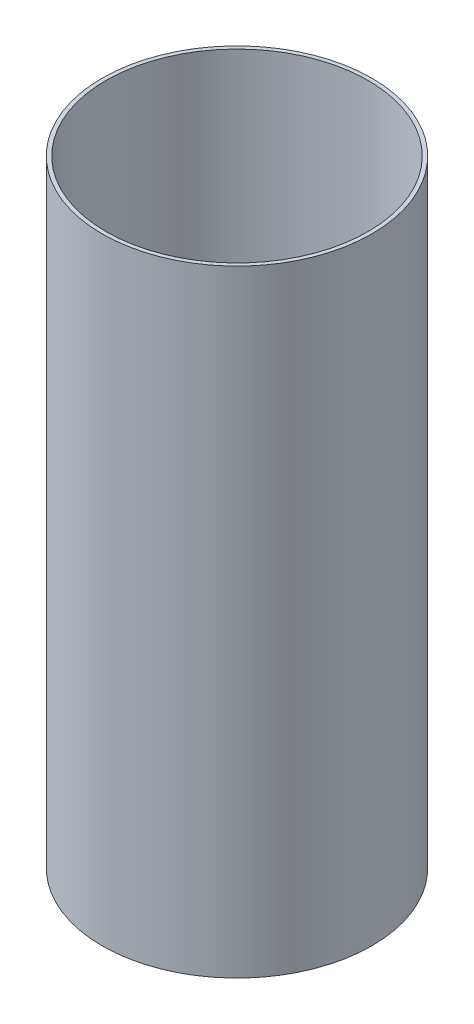
ISO-10303-21;
HEADER;
FILE_DESCRIPTION(('STEP AP214'),'2;1');
FILE_NAME('part.step','',(''),(''),'','','');
FILE_SCHEMA(('AUTOMOTIVE_DESIGN { 1 0 10303 214 1 1 1 1 }'));
ENDSEC;
DATA;
#1=APPLICATION_CONTEXT('core data for automotive mechanical design processes');
#2=APPLICATION_PROTOCOL_DEFINITION('international standard','automotive_design',2000,#1);
#3=PRODUCT_CONTEXT('',#1,'mechanical');
#4=PRODUCT('Part','Part','',(#3));
#5=PRODUCT_RELATED_PRODUCT_CATEGORY('part','',(#4));
#6=PRODUCT_DEFINITION_FORMATION('','',#4);
#7=PRODUCT_DEFINITION_CONTEXT('part definition',#1,'design');
#8=PRODUCT_DEFINITION('design','',#6,#7);
#9=PRODUCT_DEFINITION_SHAPE('','',#8);
#10=(LENGTH_UNIT() NAMED_UNIT(*) SI_UNIT(.MILLI.,.METRE.));
#11=(NAMED_UNIT(*) PLANE_ANGLE_UNIT() SI_UNIT($,.RADIAN.));
#12=(NAMED_UNIT(*) SI_UNIT($,.STERADIAN.) SOLID_ANGLE_UNIT());
#13=UNCERTAINTY_MEASURE_WITH_UNIT(LENGTH_MEASURE(1.E-05),#10,'distance_accuracy_value','');
#14=(GEOMETRIC_REPRESENTATION_CONTEXT(3) GLOBAL_UNCERTAINTY_ASSIGNED_CONTEXT((#13)) GLOBAL_UNIT_ASSIGNED_CONTEXT((#10,
#11,#12)) REPRESENTATION_CONTEXT('',''));
#15=CARTESIAN_POINT('',(0.,0.,0.));
#16=DIRECTION('',(0.,0.,1.));
#17=DIRECTION('',(1.,0.,0.));
#18=AXIS2_PLACEMENT_3D('',#15,#16,#17);
#19=CARTESIAN_POINT('',(0.,40.,0.));
#20=DIRECTION('',(0.,1.,0.));
#21=DIRECTION('',(0.,0.,1.));
#22=AXIS2_PLACEMENT_3D('',#19,#20,#21);
#23=PLANE('',#22);
#24=CARTESIAN_POINT('',(0.,40.,0.));
#25=DIRECTION('',(0.,1.,0.));
#26=DIRECTION('',(0.,0.,1.));
#27=AXIS2_PLACEMENT_3D('',#24,#25,#26);
#28=CIRCLE('',#27,17.5);
#29=CARTESIAN_POINT('',(0.,40.,17.5));
#30=VERTEX_POINT('',#29);
#31=EDGE_CURVE('E10',#30,#30,#28,.T.);
#32=ORIENTED_EDGE('',*,*,#31,.T.);
#33=EDGE_LOOP('',(#32));
#34=FACE_BOUND('',#33,.T.);
#35=CARTESIAN_POINT('',(0.,40.,0.));
#36=DIRECTION('',(0.,1.,0.));
#37=DIRECTION('',(0.,0.,1.));
#38=AXIS2_PLACEMENT_3D('',#35,#36,#37);
#39=CIRCLE('',#38,17.);
#40=CARTESIAN_POINT('',(0.,40.,17.));
#41=VERTEX_POINT('',#40);
#42=EDGE_CURVE('E54',#41,#41,#39,.T.);
#43=ORIENTED_EDGE('',*,*,#42,.F.);
#44=EDGE_LOOP('',(#43));
#45=FACE_BOUND('',#44,.T.);
#46=ADVANCED_FACE('F41',(#34,#45),#23,.T.);
#47=CARTESIAN_POINT('',(0.,-40.,0.));
#48=DIRECTION('',(0.,1.,0.));
#49=DIRECTION('',(0.,0.,1.));
#50=AXIS2_PLACEMENT_3D('',#47,#48,#49);
#51=PLANE('',#50);
#52=CARTESIAN_POINT('',(0.,-40.,0.));
#53=DIRECTION('',(0.,1.,0.));
#54=DIRECTION('',(0.,0.,1.));
#55=AXIS2_PLACEMENT_3D('',#52,#53,#54);
#56=CIRCLE('',#55,17.5);
#57=CARTESIAN_POINT('',(0.,-40.,17.5));
#58=VERTEX_POINT('',#57);
#59=EDGE_CURVE('E45',#58,#58,#56,.T.);
#60=ORIENTED_EDGE('',*,*,#59,.F.);
#61=EDGE_LOOP('',(#60));
#62=FACE_BOUND('',#61,.T.);
#63=CARTESIAN_POINT('',(0.,-40.,0.));
#64=DIRECTION('',(0.,1.,0.));
#65=DIRECTION('',(0.,0.,1.));
#66=AXIS2_PLACEMENT_3D('',#63,#64,#65);
#67=CIRCLE('',#66,17.);
#68=CARTESIAN_POINT('',(0.,-40.,17.));
#69=VERTEX_POINT('',#68);
#70=EDGE_CURVE('E56',#69,#69,#67,.T.);
#71=ORIENTED_EDGE('',*,*,#70,.T.);
#72=EDGE_LOOP('',(#71));
#73=FACE_BOUND('',#72,.T.);
#74=ADVANCED_FACE('F68',(#62,#73),#51,.F.);
#75=CARTESIAN_POINT('',(0.,40.,0.));
#76=DIRECTION('',(0.,-1.,0.));
#77=DIRECTION('',(0.,0.,-1.));
#78=AXIS2_PLACEMENT_3D('',#75,#76,#77);
#79=CYLINDRICAL_SURFACE('',#78,17.5);
#80=ORIENTED_EDGE('',*,*,#31,.F.);
#81=EDGE_LOOP('',(#80));
#82=FACE_BOUND('',#81,.T.);
#83=ORIENTED_EDGE('',*,*,#59,.T.);
#84=EDGE_LOOP('',(#83));
#85=FACE_BOUND('',#84,.T.);
#86=ADVANCED_FACE('F43',(#82,#85),#79,.T.);
#87=CARTESIAN_POINT('',(0.,40.,0.));
#88=DIRECTION('',(0.,-1.,0.));
#89=DIRECTION('',(0.,0.,-1.));
#90=AXIS2_PLACEMENT_3D('',#87,#88,#89);
#91=CYLINDRICAL_SURFACE('',#90,17.);
#92=ORIENTED_EDGE('',*,*,#42,.T.);
#93=EDGE_LOOP('',(#92));
#94=FACE_BOUND('',#93,.T.);
#95=ORIENTED_EDGE('',*,*,#70,.F.);
#96=EDGE_LOOP('',(#95));
#97=FACE_BOUND('',#96,.T.);
#98=ADVANCED_FACE('F64',(#94,#97),#91,.F.);
#99=CLOSED_SHELL('',(#46,#74,#86,#98));
#100=MANIFOLD_SOLID_BREP('B2',#99);
#101=ADVANCED_BREP_SHAPE_REPRESENTATION('',(#18,#100),#14);
#102=SHAPE_DEFINITION_REPRESENTATION(#9,#101);
ENDSEC;
END-ISO-10303-21;
